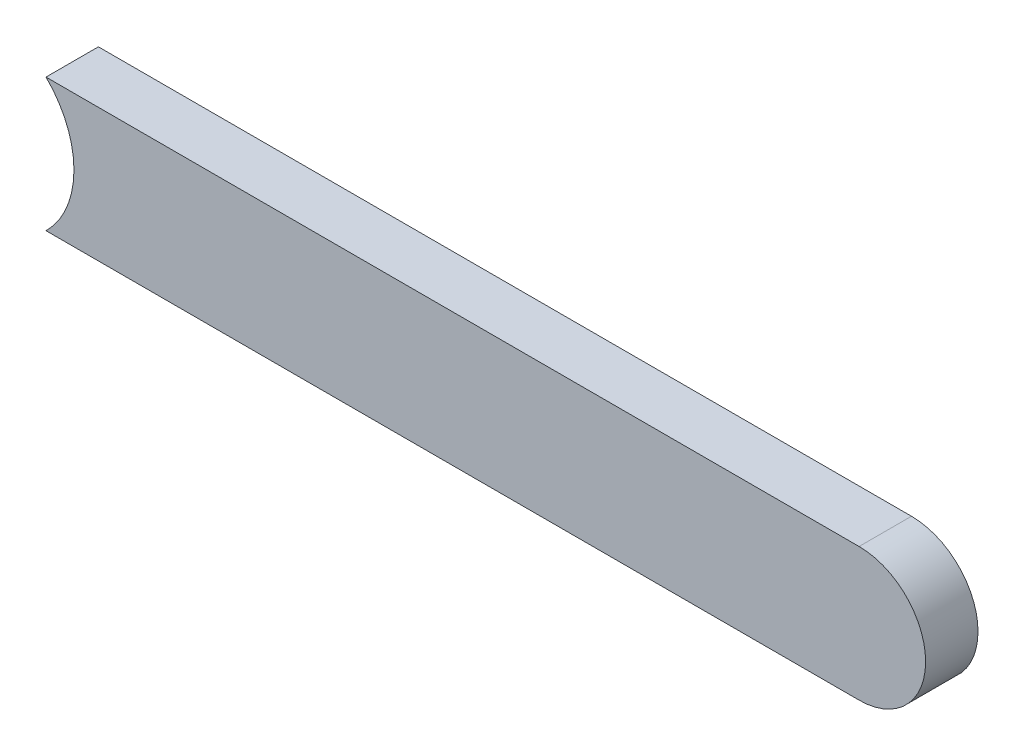
ISO-10303-21;
HEADER;
FILE_DESCRIPTION(('STEP AP214'),'2;1');
FILE_NAME('part.step','',(''),(''),'','','');
FILE_SCHEMA(('AUTOMOTIVE_DESIGN { 1 0 10303 214 1 1 1 1 }'));
ENDSEC;
DATA;
#1=APPLICATION_CONTEXT('core data for automotive mechanical design processes');
#2=APPLICATION_PROTOCOL_DEFINITION('international standard','automotive_design',2000,#1);
#3=PRODUCT_CONTEXT('',#1,'mechanical');
#4=PRODUCT('Part','Part','',(#3));
#5=PRODUCT_RELATED_PRODUCT_CATEGORY('part','',(#4));
#6=PRODUCT_DEFINITION_FORMATION('','',#4);
#7=PRODUCT_DEFINITION_CONTEXT('part definition',#1,'design');
#8=PRODUCT_DEFINITION('design','',#6,#7);
#9=PRODUCT_DEFINITION_SHAPE('','',#8);
#10=(LENGTH_UNIT() NAMED_UNIT(*) SI_UNIT(.MILLI.,.METRE.));
#11=(NAMED_UNIT(*) PLANE_ANGLE_UNIT() SI_UNIT($,.RADIAN.));
#12=(NAMED_UNIT(*) SI_UNIT($,.STERADIAN.) SOLID_ANGLE_UNIT());
#13=UNCERTAINTY_MEASURE_WITH_UNIT(LENGTH_MEASURE(1.E-05),#10,'distance_accuracy_value','');
#14=(GEOMETRIC_REPRESENTATION_CONTEXT(3) GLOBAL_UNCERTAINTY_ASSIGNED_CONTEXT((#13)) GLOBAL_UNIT_ASSIGNED_CONTEXT((#10,
#11,#12)) REPRESENTATION_CONTEXT('',''));
#15=CARTESIAN_POINT('',(0.,0.,0.));
#16=DIRECTION('',(0.,0.,1.));
#17=DIRECTION('',(1.,0.,0.));
#18=AXIS2_PLACEMENT_3D('',#15,#16,#17);
#19=CARTESIAN_POINT('',(104.465068157867,67.691,0.));
#20=DIRECTION('',(0.,1.,0.));
#21=DIRECTION('',(1.,0.,0.));
#22=AXIS2_PLACEMENT_3D('',#19,#20,#21);
#23=PLANE('',#22);
#24=DIRECTION('',(1.,0.,0.));
#25=VECTOR('',#24,1.);
#26=CARTESIAN_POINT('',(104.2162,67.691,0.1999996));
#27=LINE('',#26,#25);
#28=CARTESIAN_POINT('',(104.465068157867,67.691,0.1999996));
#29=VERTEX_POINT('',#28);
#30=CARTESIAN_POINT('',(107.569,67.691,0.1999996));
#31=VERTEX_POINT('',#30);
#32=EDGE_CURVE('E11',#29,#31,#27,.T.);
#33=ORIENTED_EDGE('',*,*,#32,.F.);
#34=DIRECTION('',(0.,0.,1.));
#35=VECTOR('',#34,1.);
#36=CARTESIAN_POINT('',(104.465068157867,67.691,0.));
#37=LINE('',#36,#35);
#38=CARTESIAN_POINT('',(104.465068157867,67.691,0.));
#39=VERTEX_POINT('',#38);
#40=EDGE_CURVE('E24',#39,#29,#37,.T.);
#41=ORIENTED_EDGE('',*,*,#40,.F.);
#42=DIRECTION('',(1.,0.,0.));
#43=VECTOR('',#42,1.);
#44=CARTESIAN_POINT('',(104.2162,67.691,0.));
#45=LINE('',#44,#43);
#46=CARTESIAN_POINT('',(107.569,67.691,0.));
#47=VERTEX_POINT('',#46);
#48=EDGE_CURVE('E82',#39,#47,#45,.T.);
#49=ORIENTED_EDGE('',*,*,#48,.T.);
#50=DIRECTION('',(0.,0.,1.));
#51=VECTOR('',#50,1.);
#52=CARTESIAN_POINT('',(107.569,67.691,0.));
#53=LINE('',#52,#51);
#54=EDGE_CURVE('E37',#47,#31,#53,.T.);
#55=ORIENTED_EDGE('',*,*,#54,.T.);
#56=EDGE_LOOP('',(#33,#41,#49,#55));
#57=FACE_BOUND('',#56,.T.);
#58=ADVANCED_FACE('F17',(#57),#23,.F.);
#59=CARTESIAN_POINT('',(107.569,67.945,0.));
#60=DIRECTION('',(0.,0.,-1.));
#61=DIRECTION('',(0.,-1.,0.));
#62=AXIS2_PLACEMENT_3D('',#59,#60,#61);
#63=CYLINDRICAL_SURFACE('',#62,0.254);
#64=CARTESIAN_POINT('',(107.569,67.945,0.1999996));
#65=DIRECTION('',(0.,0.,1.));
#66=DIRECTION('',(0.,-1.,0.));
#67=AXIS2_PLACEMENT_3D('',#64,#65,#66);
#68=CIRCLE('',#67,0.254);
#69=CARTESIAN_POINT('',(107.569,68.199,0.1999996));
#70=VERTEX_POINT('',#69);
#71=EDGE_CURVE('E97',#31,#70,#68,.T.);
#72=ORIENTED_EDGE('',*,*,#71,.F.);
#73=ORIENTED_EDGE('',*,*,#54,.F.);
#74=CARTESIAN_POINT('',(107.569,67.945,0.));
#75=DIRECTION('',(0.,0.,1.));
#76=DIRECTION('',(0.,-1.,0.));
#77=AXIS2_PLACEMENT_3D('',#74,#75,#76);
#78=CIRCLE('',#77,0.254);
#79=CARTESIAN_POINT('',(107.569,68.199,0.));
#80=VERTEX_POINT('',#79);
#81=EDGE_CURVE('E94',#47,#80,#78,.T.);
#82=ORIENTED_EDGE('',*,*,#81,.T.);
#83=DIRECTION('',(0.,0.,1.));
#84=VECTOR('',#83,1.);
#85=CARTESIAN_POINT('',(107.569,68.199,0.));
#86=LINE('',#85,#84);
#87=EDGE_CURVE('E92',#80,#70,#86,.T.);
#88=ORIENTED_EDGE('',*,*,#87,.T.);
#89=EDGE_LOOP('',(#72,#73,#82,#88));
#90=FACE_BOUND('',#89,.T.);
#91=ADVANCED_FACE('F103',(#90),#63,.T.);
#92=CARTESIAN_POINT('',(107.569,68.199,0.));
#93=DIRECTION('',(0.,-1.,0.));
#94=DIRECTION('',(-1.,0.,0.));
#95=AXIS2_PLACEMENT_3D('',#92,#93,#94);
#96=PLANE('',#95);
#97=DIRECTION('',(-1.,0.,0.));
#98=VECTOR('',#97,1.);
#99=CARTESIAN_POINT('',(107.569,68.199,0.1999996));
#100=LINE('',#99,#98);
#101=CARTESIAN_POINT('',(104.465068157867,68.199,0.1999996));
#102=VERTEX_POINT('',#101);
#103=EDGE_CURVE('E89',#70,#102,#100,.T.);
#104=ORIENTED_EDGE('',*,*,#103,.F.);
#105=ORIENTED_EDGE('',*,*,#87,.F.);
#106=DIRECTION('',(-1.,0.,0.));
#107=VECTOR('',#106,1.);
#108=CARTESIAN_POINT('',(107.569,68.199,0.));
#109=LINE('',#108,#107);
#110=CARTESIAN_POINT('',(104.465068157867,68.199,0.));
#111=VERTEX_POINT('',#110);
#112=EDGE_CURVE('E87',#80,#111,#109,.T.);
#113=ORIENTED_EDGE('',*,*,#112,.T.);
#114=DIRECTION('',(0.,0.,1.));
#115=VECTOR('',#114,1.);
#116=CARTESIAN_POINT('',(104.465068157867,68.199,0.));
#117=LINE('',#116,#115);
#118=EDGE_CURVE('E69',#111,#102,#117,.T.);
#119=ORIENTED_EDGE('',*,*,#118,.T.);
#120=EDGE_LOOP('',(#104,#105,#113,#119));
#121=FACE_BOUND('',#120,.T.);
#122=ADVANCED_FACE('F108',(#121),#96,.F.);
#123=CARTESIAN_POINT('',(104.2162,67.945,0.));
#124=DIRECTION('',(0.,0.,-1.));
#125=DIRECTION('',(1.,0.,0.));
#126=AXIS2_PLACEMENT_3D('',#123,#124,#125);
#127=CYLINDRICAL_SURFACE('',#126,0.3556);
#128=DIRECTION('',(0.,0.,1.));
#129=VECTOR('',#128,1.);
#130=CARTESIAN_POINT('',(104.5718,67.945,0.));
#131=LINE('',#130,#129);
#132=CARTESIAN_POINT('',(104.5718,67.945,0.));
#133=VERTEX_POINT('',#132);
#134=CARTESIAN_POINT('',(104.5718,67.945,0.1999996));
#135=VERTEX_POINT('',#134);
#136=EDGE_CURVE('E59',#133,#135,#131,.T.);
#137=ORIENTED_EDGE('',*,*,#136,.T.);
#138=CARTESIAN_POINT('',(104.2162,67.945,0.1999996));
#139=DIRECTION('',(0.,0.,1.));
#140=DIRECTION('',(1.,0.,0.));
#141=AXIS2_PLACEMENT_3D('',#138,#139,#140);
#142=CIRCLE('',#141,0.3556);
#143=EDGE_CURVE('E70',#135,#102,#142,.T.);
#144=ORIENTED_EDGE('',*,*,#143,.T.);
#145=ORIENTED_EDGE('',*,*,#118,.F.);
#146=CARTESIAN_POINT('',(104.2162,67.945,0.));
#147=DIRECTION('',(0.,0.,1.));
#148=DIRECTION('',(1.,0.,0.));
#149=AXIS2_PLACEMENT_3D('',#146,#147,#148);
#150=CIRCLE('',#149,0.3556);
#151=EDGE_CURVE('E73',#133,#111,#150,.T.);
#152=ORIENTED_EDGE('',*,*,#151,.F.);
#153=EDGE_LOOP('',(#137,#144,#145,#152));
#154=FACE_BOUND('',#153,.T.);
#155=ADVANCED_FACE('F74',(#154),#127,.F.);
#156=CARTESIAN_POINT('',(104.2162,67.945,0.));
#157=DIRECTION('',(0.,0.,-1.));
#158=DIRECTION('',(1.,0.,0.));
#159=AXIS2_PLACEMENT_3D('',#156,#157,#158);
#160=CYLINDRICAL_SURFACE('',#159,0.3556);
#161=ORIENTED_EDGE('',*,*,#40,.T.);
#162=CARTESIAN_POINT('',(104.2162,67.945,0.1999996));
#163=DIRECTION('',(0.,0.,1.));
#164=DIRECTION('',(1.,0.,0.));
#165=AXIS2_PLACEMENT_3D('',#162,#163,#164);
#166=CIRCLE('',#165,0.3556);
#167=EDGE_CURVE('E65',#29,#135,#166,.T.);
#168=ORIENTED_EDGE('',*,*,#167,.T.);
#169=ORIENTED_EDGE('',*,*,#136,.F.);
#170=EDGE_CURVE('E63',#39,#133,#150,.T.);
#171=ORIENTED_EDGE('',*,*,#170,.F.);
#172=EDGE_LOOP('',(#161,#168,#169,#171));
#173=FACE_BOUND('',#172,.T.);
#174=ADVANCED_FACE('F61',(#173),#160,.F.);
#175=CARTESIAN_POINT('',(104.2162,67.691,0.));
#176=DIRECTION('',(0.,0.,-1.));
#177=DIRECTION('',(-1.,0.,0.));
#178=AXIS2_PLACEMENT_3D('',#175,#176,#177);
#179=PLANE('',#178);
#180=ORIENTED_EDGE('',*,*,#48,.F.);
#181=ORIENTED_EDGE('',*,*,#170,.T.);
#182=ORIENTED_EDGE('',*,*,#151,.T.);
#183=ORIENTED_EDGE('',*,*,#112,.F.);
#184=ORIENTED_EDGE('',*,*,#81,.F.);
#185=EDGE_LOOP('',(#180,#181,#182,#183,#184));
#186=FACE_BOUND('',#185,.T.);
#187=ADVANCED_FACE('F80',(#186),#179,.T.);
#188=CARTESIAN_POINT('',(104.2162,67.691,0.1999996));
#189=DIRECTION('',(0.,0.,-1.));
#190=DIRECTION('',(-1.,0.,0.));
#191=AXIS2_PLACEMENT_3D('',#188,#189,#190);
#192=PLANE('',#191);
#193=ORIENTED_EDGE('',*,*,#167,.F.);
#194=ORIENTED_EDGE('',*,*,#32,.T.);
#195=ORIENTED_EDGE('',*,*,#71,.T.);
#196=ORIENTED_EDGE('',*,*,#103,.T.);
#197=ORIENTED_EDGE('',*,*,#143,.F.);
#198=EDGE_LOOP('',(#193,#194,#195,#196,#197));
#199=FACE_BOUND('',#198,.T.);
#200=ADVANCED_FACE('F106',(#199),#192,.F.);
#201=CLOSED_SHELL('',(#58,#91,#122,#155,#174,#187,#200));
#202=MANIFOLD_SOLID_BREP('B1',#201);
#203=ADVANCED_BREP_SHAPE_REPRESENTATION('',(#18,#202),#14);
#204=SHAPE_DEFINITION_REPRESENTATION(#9,#203);
ENDSEC;
END-ISO-10303-21;
